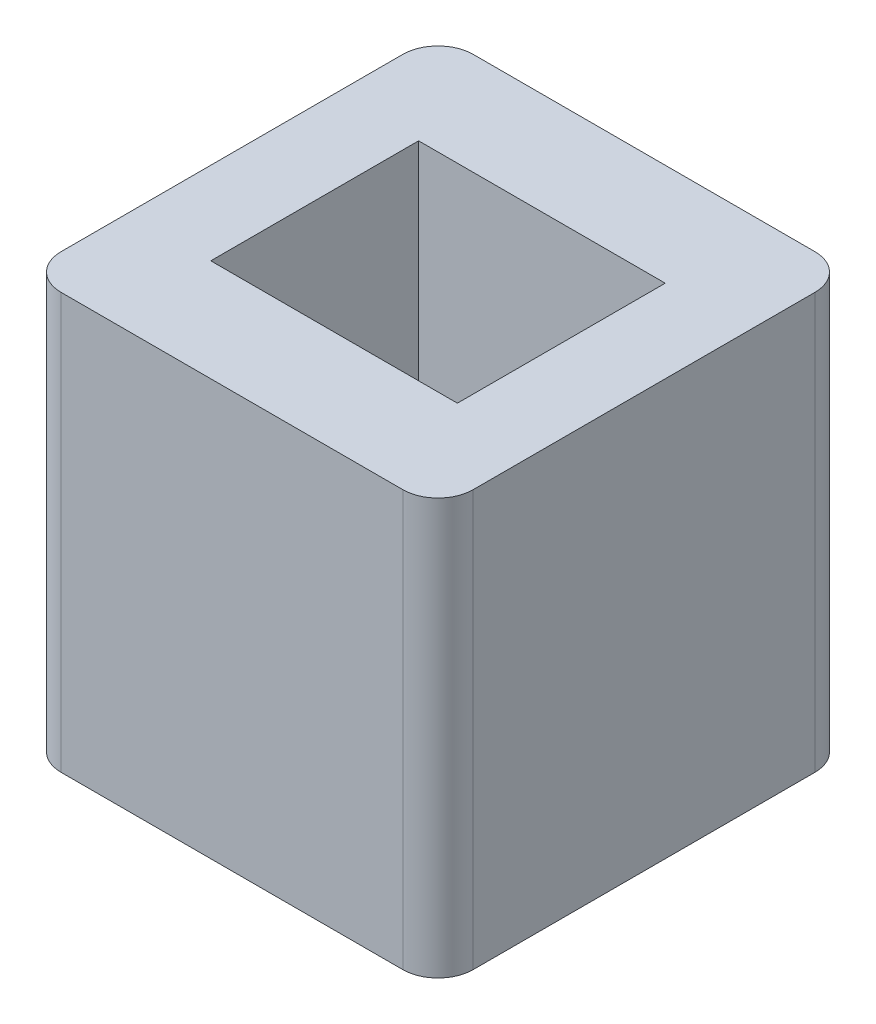
ISO-10303-21;
HEADER;
FILE_DESCRIPTION(('STEP AP214'),'2;1');
FILE_NAME('part.step','',(''),(''),'','','');
FILE_SCHEMA(('AUTOMOTIVE_DESIGN { 1 0 10303 214 1 1 1 1 }'));
ENDSEC;
DATA;
#1=APPLICATION_CONTEXT('core data for automotive mechanical design processes');
#2=APPLICATION_PROTOCOL_DEFINITION('international standard','automotive_design',2000,#1);
#3=PRODUCT_CONTEXT('',#1,'mechanical');
#4=PRODUCT('Part','Part','',(#3));
#5=PRODUCT_RELATED_PRODUCT_CATEGORY('part','',(#4));
#6=PRODUCT_DEFINITION_FORMATION('','',#4);
#7=PRODUCT_DEFINITION_CONTEXT('part definition',#1,'design');
#8=PRODUCT_DEFINITION('design','',#6,#7);
#9=PRODUCT_DEFINITION_SHAPE('','',#8);
#10=(LENGTH_UNIT() NAMED_UNIT(*) SI_UNIT(.MILLI.,.METRE.));
#11=(NAMED_UNIT(*) PLANE_ANGLE_UNIT() SI_UNIT($,.RADIAN.));
#12=(NAMED_UNIT(*) SI_UNIT($,.STERADIAN.) SOLID_ANGLE_UNIT());
#13=UNCERTAINTY_MEASURE_WITH_UNIT(LENGTH_MEASURE(1.E-05),#10,'distance_accuracy_value','');
#14=(GEOMETRIC_REPRESENTATION_CONTEXT(3) GLOBAL_UNCERTAINTY_ASSIGNED_CONTEXT((#13)) GLOBAL_UNIT_ASSIGNED_CONTEXT((#10,
#11,#12)) REPRESENTATION_CONTEXT('',''));
#15=CARTESIAN_POINT('',(0.,0.,0.));
#16=DIRECTION('',(0.,0.,1.));
#17=DIRECTION('',(1.,0.,0.));
#18=AXIS2_PLACEMENT_3D('',#15,#16,#17);
#19=CARTESIAN_POINT('',(-24.25,29.5,24.25));
#20=DIRECTION('',(0.,-1.,0.));
#21=DIRECTION('',(0.,0.,-1.));
#22=AXIS2_PLACEMENT_3D('',#19,#20,#21);
#23=PLANE('',#22);
#24=CARTESIAN_POINT('',(-24.25,29.5,24.25));
#25=DIRECTION('',(0.,1.,0.));
#26=DIRECTION('',(0.,0.,-1.));
#27=AXIS2_PLACEMENT_3D('',#24,#25,#26);
#28=CIRCLE('',#27,5.);
#29=CARTESIAN_POINT('',(-29.25,29.5,24.25));
#30=VERTEX_POINT('',#29);
#31=CARTESIAN_POINT('',(-24.25,29.5,29.25));
#32=VERTEX_POINT('',#31);
#33=EDGE_CURVE('E158',#30,#32,#28,.T.);
#34=ORIENTED_EDGE('',*,*,#33,.T.);
#35=DIRECTION('',(1.,0.,0.));
#36=VECTOR('',#35,1.);
#37=CARTESIAN_POINT('',(-24.25,29.5,29.25));
#38=LINE('',#37,#36);
#39=CARTESIAN_POINT('',(24.25,29.5,29.25));
#40=VERTEX_POINT('',#39);
#41=EDGE_CURVE('E161',#32,#40,#38,.T.);
#42=ORIENTED_EDGE('',*,*,#41,.T.);
#43=CARTESIAN_POINT('',(24.25,29.5,24.25));
#44=DIRECTION('',(0.,1.,0.));
#45=DIRECTION('',(0.,0.,-1.));
#46=AXIS2_PLACEMENT_3D('',#43,#44,#45);
#47=CIRCLE('',#46,5.);
#48=CARTESIAN_POINT('',(29.25,29.5,24.25));
#49=VERTEX_POINT('',#48);
#50=EDGE_CURVE('E164',#40,#49,#47,.T.);
#51=ORIENTED_EDGE('',*,*,#50,.T.);
#52=DIRECTION('',(0.,0.,-1.));
#53=VECTOR('',#52,1.);
#54=CARTESIAN_POINT('',(29.25,29.5,-24.25));
#55=LINE('',#54,#53);
#56=CARTESIAN_POINT('',(29.25,29.5,-24.25));
#57=VERTEX_POINT('',#56);
#58=EDGE_CURVE('E166',#49,#57,#55,.T.);
#59=ORIENTED_EDGE('',*,*,#58,.T.);
#60=CARTESIAN_POINT('',(24.25,29.5,-24.25));
#61=DIRECTION('',(0.,1.,0.));
#62=DIRECTION('',(0.,0.,1.));
#63=AXIS2_PLACEMENT_3D('',#60,#61,#62);
#64=CIRCLE('',#63,5.);
#65=CARTESIAN_POINT('',(24.25,29.5,-29.25));
#66=VERTEX_POINT('',#65);
#67=EDGE_CURVE('E168',#57,#66,#64,.T.);
#68=ORIENTED_EDGE('',*,*,#67,.T.);
#69=DIRECTION('',(-1.,0.,0.));
#70=VECTOR('',#69,1.);
#71=CARTESIAN_POINT('',(-24.25,29.5,-29.25));
#72=LINE('',#71,#70);
#73=CARTESIAN_POINT('',(-24.25,29.5,-29.25));
#74=VERTEX_POINT('',#73);
#75=EDGE_CURVE('E170',#66,#74,#72,.T.);
#76=ORIENTED_EDGE('',*,*,#75,.T.);
#77=CARTESIAN_POINT('',(-24.25,29.5,-24.25));
#78=DIRECTION('',(0.,1.,0.));
#79=DIRECTION('',(0.,0.,-1.));
#80=AXIS2_PLACEMENT_3D('',#77,#78,#79);
#81=CIRCLE('',#80,5.);
#82=CARTESIAN_POINT('',(-29.25,29.5,-24.25));
#83=VERTEX_POINT('',#82);
#84=EDGE_CURVE('E172',#74,#83,#81,.T.);
#85=ORIENTED_EDGE('',*,*,#84,.T.);
#86=DIRECTION('',(0.,0.,1.));
#87=VECTOR('',#86,1.);
#88=CARTESIAN_POINT('',(-29.25,29.5,-24.25));
#89=LINE('',#88,#87);
#90=EDGE_CURVE('E174',#83,#30,#89,.T.);
#91=ORIENTED_EDGE('',*,*,#90,.T.);
#92=EDGE_LOOP('',(#34,#42,#51,#59,#68,#76,#85,#91));
#93=FACE_BOUND('',#92,.T.);
#94=DIRECTION('',(0.,0.,-1.));
#95=VECTOR('',#94,1.);
#96=CARTESIAN_POINT('',(17.5,29.5,-14.75));
#97=LINE('',#96,#95);
#98=CARTESIAN_POINT('',(17.5,29.5,14.75));
#99=VERTEX_POINT('',#98);
#100=CARTESIAN_POINT('',(17.5,29.5,-14.75));
#101=VERTEX_POINT('',#100);
#102=EDGE_CURVE('E122',#99,#101,#97,.T.);
#103=ORIENTED_EDGE('',*,*,#102,.F.);
#104=DIRECTION('',(1.,0.,0.));
#105=VECTOR('',#104,1.);
#106=CARTESIAN_POINT('',(-17.5,29.5,14.75));
#107=LINE('',#106,#105);
#108=CARTESIAN_POINT('',(-17.5,29.5,14.75));
#109=VERTEX_POINT('',#108);
#110=EDGE_CURVE('E144',#109,#99,#107,.T.);
#111=ORIENTED_EDGE('',*,*,#110,.F.);
#112=DIRECTION('',(0.,0.,1.));
#113=VECTOR('',#112,1.);
#114=CARTESIAN_POINT('',(-17.5,29.5,-14.75));
#115=LINE('',#114,#113);
#116=CARTESIAN_POINT('',(-17.5,29.5,-14.75));
#117=VERTEX_POINT('',#116);
#118=EDGE_CURVE('E142',#117,#109,#115,.T.);
#119=ORIENTED_EDGE('',*,*,#118,.F.);
#120=DIRECTION('',(-1.,0.,0.));
#121=VECTOR('',#120,1.);
#122=CARTESIAN_POINT('',(-17.5,29.5,-14.75));
#123=LINE('',#122,#121);
#124=EDGE_CURVE('E130',#101,#117,#123,.T.);
#125=ORIENTED_EDGE('',*,*,#124,.F.);
#126=EDGE_LOOP('',(#103,#111,#119,#125));
#127=FACE_BOUND('',#126,.T.);
#128=ADVANCED_FACE('F33',(#93,#127),#23,.F.);
#129=CARTESIAN_POINT('',(-24.25,-29.5,24.25));
#130=DIRECTION('',(0.,-1.,0.));
#131=DIRECTION('',(0.,0.,-1.));
#132=AXIS2_PLACEMENT_3D('',#129,#130,#131);
#133=PLANE('',#132);
#134=CARTESIAN_POINT('',(-24.25,-29.5,24.25));
#135=DIRECTION('',(0.,1.,0.));
#136=DIRECTION('',(0.,0.,-1.));
#137=AXIS2_PLACEMENT_3D('',#134,#135,#136);
#138=CIRCLE('',#137,5.);
#139=CARTESIAN_POINT('',(-29.25,-29.5,24.25));
#140=VERTEX_POINT('',#139);
#141=CARTESIAN_POINT('',(-24.25,-29.5,29.25));
#142=VERTEX_POINT('',#141);
#143=EDGE_CURVE('E138',#140,#142,#138,.T.);
#144=ORIENTED_EDGE('',*,*,#143,.F.);
#145=DIRECTION('',(0.,0.,1.));
#146=VECTOR('',#145,1.);
#147=CARTESIAN_POINT('',(-29.25,-29.5,-24.25));
#148=LINE('',#147,#146);
#149=CARTESIAN_POINT('',(-29.25,-29.5,-24.25));
#150=VERTEX_POINT('',#149);
#151=EDGE_CURVE('E162',#150,#140,#148,.T.);
#152=ORIENTED_EDGE('',*,*,#151,.F.);
#153=CARTESIAN_POINT('',(-24.25,-29.5,-24.25));
#154=DIRECTION('',(0.,1.,0.));
#155=DIRECTION('',(0.,0.,-1.));
#156=AXIS2_PLACEMENT_3D('',#153,#154,#155);
#157=CIRCLE('',#156,5.);
#158=CARTESIAN_POINT('',(-24.25,-29.5,-29.25));
#159=VERTEX_POINT('',#158);
#160=EDGE_CURVE('E189',#159,#150,#157,.T.);
#161=ORIENTED_EDGE('',*,*,#160,.F.);
#162=DIRECTION('',(-1.,0.,0.));
#163=VECTOR('',#162,1.);
#164=CARTESIAN_POINT('',(-24.25,-29.5,-29.25));
#165=LINE('',#164,#163);
#166=CARTESIAN_POINT('',(24.25,-29.5,-29.25));
#167=VERTEX_POINT('',#166);
#168=EDGE_CURVE('E187',#167,#159,#165,.T.);
#169=ORIENTED_EDGE('',*,*,#168,.F.);
#170=CARTESIAN_POINT('',(24.25,-29.5,-24.25));
#171=DIRECTION('',(0.,1.,0.));
#172=DIRECTION('',(0.,0.,1.));
#173=AXIS2_PLACEMENT_3D('',#170,#171,#172);
#174=CIRCLE('',#173,5.);
#175=CARTESIAN_POINT('',(29.25,-29.5,-24.25));
#176=VERTEX_POINT('',#175);
#177=EDGE_CURVE('E185',#176,#167,#174,.T.);
#178=ORIENTED_EDGE('',*,*,#177,.F.);
#179=DIRECTION('',(0.,0.,-1.));
#180=VECTOR('',#179,1.);
#181=CARTESIAN_POINT('',(29.25,-29.5,-24.25));
#182=LINE('',#181,#180);
#183=CARTESIAN_POINT('',(29.25,-29.5,24.25));
#184=VERTEX_POINT('',#183);
#185=EDGE_CURVE('E183',#184,#176,#182,.T.);
#186=ORIENTED_EDGE('',*,*,#185,.F.);
#187=CARTESIAN_POINT('',(24.25,-29.5,24.25));
#188=DIRECTION('',(0.,1.,0.));
#189=DIRECTION('',(0.,0.,-1.));
#190=AXIS2_PLACEMENT_3D('',#187,#188,#189);
#191=CIRCLE('',#190,5.);
#192=CARTESIAN_POINT('',(24.25,-29.5,29.25));
#193=VERTEX_POINT('',#192);
#194=EDGE_CURVE('E181',#193,#184,#191,.T.);
#195=ORIENTED_EDGE('',*,*,#194,.F.);
#196=DIRECTION('',(1.,0.,0.));
#197=VECTOR('',#196,1.);
#198=CARTESIAN_POINT('',(-24.25,-29.5,29.25));
#199=LINE('',#198,#197);
#200=EDGE_CURVE('E179',#142,#193,#199,.T.);
#201=ORIENTED_EDGE('',*,*,#200,.F.);
#202=EDGE_LOOP('',(#144,#152,#161,#169,#178,#186,#195,#201));
#203=FACE_BOUND('',#202,.T.);
#204=DIRECTION('',(1.,0.,0.));
#205=VECTOR('',#204,1.);
#206=CARTESIAN_POINT('',(-17.5,-29.5,14.75));
#207=LINE('',#206,#205);
#208=CARTESIAN_POINT('',(-17.5,-29.5,14.75));
#209=VERTEX_POINT('',#208);
#210=CARTESIAN_POINT('',(17.5,-29.5,14.75));
#211=VERTEX_POINT('',#210);
#212=EDGE_CURVE('E131',#209,#211,#207,.T.);
#213=ORIENTED_EDGE('',*,*,#212,.T.);
#214=DIRECTION('',(0.,0.,-1.));
#215=VECTOR('',#214,1.);
#216=CARTESIAN_POINT('',(17.5,-29.5,-14.75));
#217=LINE('',#216,#215);
#218=CARTESIAN_POINT('',(17.5,-29.5,-14.75));
#219=VERTEX_POINT('',#218);
#220=EDGE_CURVE('E56',#211,#219,#217,.T.);
#221=ORIENTED_EDGE('',*,*,#220,.T.);
#222=DIRECTION('',(-1.,0.,0.));
#223=VECTOR('',#222,1.);
#224=CARTESIAN_POINT('',(-17.5,-29.5,-14.75));
#225=LINE('',#224,#223);
#226=CARTESIAN_POINT('',(-17.5,-29.5,-14.75));
#227=VERTEX_POINT('',#226);
#228=EDGE_CURVE('E137',#219,#227,#225,.T.);
#229=ORIENTED_EDGE('',*,*,#228,.T.);
#230=DIRECTION('',(0.,0.,1.));
#231=VECTOR('',#230,1.);
#232=CARTESIAN_POINT('',(-17.5,-29.5,-14.75));
#233=LINE('',#232,#231);
#234=EDGE_CURVE('E150',#227,#209,#233,.T.);
#235=ORIENTED_EDGE('',*,*,#234,.T.);
#236=EDGE_LOOP('',(#213,#221,#229,#235));
#237=FACE_BOUND('',#236,.T.);
#238=ADVANCED_FACE('F219',(#203,#237),#133,.T.);
#239=CARTESIAN_POINT('',(-24.25,29.5,24.25));
#240=DIRECTION('',(0.,-1.,0.));
#241=DIRECTION('',(0.,0.,-1.));
#242=AXIS2_PLACEMENT_3D('',#239,#240,#241);
#243=CYLINDRICAL_SURFACE('',#242,5.);
#244=ORIENTED_EDGE('',*,*,#143,.T.);
#245=DIRECTION('',(0.,-1.,0.));
#246=VECTOR('',#245,1.);
#247=CARTESIAN_POINT('',(-24.25,29.5,29.25));
#248=LINE('',#247,#246);
#249=EDGE_CURVE('E11',#32,#142,#248,.T.);
#250=ORIENTED_EDGE('',*,*,#249,.F.);
#251=ORIENTED_EDGE('',*,*,#33,.F.);
#252=DIRECTION('',(0.,-1.,0.));
#253=VECTOR('',#252,1.);
#254=CARTESIAN_POINT('',(-29.25,29.5,24.25));
#255=LINE('',#254,#253);
#256=EDGE_CURVE('E176',#30,#140,#255,.T.);
#257=ORIENTED_EDGE('',*,*,#256,.T.);
#258=EDGE_LOOP('',(#244,#250,#251,#257));
#259=FACE_BOUND('',#258,.T.);
#260=ADVANCED_FACE('F35',(#259),#243,.T.);
#261=CARTESIAN_POINT('',(-24.25,29.5,29.25));
#262=DIRECTION('',(0.,0.,-1.));
#263=DIRECTION('',(-1.,0.,0.));
#264=AXIS2_PLACEMENT_3D('',#261,#262,#263);
#265=PLANE('',#264);
#266=ORIENTED_EDGE('',*,*,#200,.T.);
#267=DIRECTION('',(0.,-1.,0.));
#268=VECTOR('',#267,1.);
#269=CARTESIAN_POINT('',(24.25,29.5,29.25));
#270=LINE('',#269,#268);
#271=EDGE_CURVE('E41',#40,#193,#270,.T.);
#272=ORIENTED_EDGE('',*,*,#271,.F.);
#273=ORIENTED_EDGE('',*,*,#41,.F.);
#274=ORIENTED_EDGE('',*,*,#249,.T.);
#275=EDGE_LOOP('',(#266,#272,#273,#274));
#276=FACE_BOUND('',#275,.T.);
#277=ADVANCED_FACE('F236',(#276),#265,.F.);
#278=CARTESIAN_POINT('',(24.25,29.5,24.25));
#279=DIRECTION('',(0.,-1.,0.));
#280=DIRECTION('',(0.,0.,-1.));
#281=AXIS2_PLACEMENT_3D('',#278,#279,#280);
#282=CYLINDRICAL_SURFACE('',#281,5.);
#283=ORIENTED_EDGE('',*,*,#194,.T.);
#284=DIRECTION('',(0.,-1.,0.));
#285=VECTOR('',#284,1.);
#286=CARTESIAN_POINT('',(29.25,29.5,24.25));
#287=LINE('',#286,#285);
#288=EDGE_CURVE('E206',#49,#184,#287,.T.);
#289=ORIENTED_EDGE('',*,*,#288,.F.);
#290=ORIENTED_EDGE('',*,*,#50,.F.);
#291=ORIENTED_EDGE('',*,*,#271,.T.);
#292=EDGE_LOOP('',(#283,#289,#290,#291));
#293=FACE_BOUND('',#292,.T.);
#294=ADVANCED_FACE('F213',(#293),#282,.T.);
#295=CARTESIAN_POINT('',(29.25,29.5,-24.25));
#296=DIRECTION('',(-1.,0.,0.));
#297=DIRECTION('',(0.,0.,1.));
#298=AXIS2_PLACEMENT_3D('',#295,#296,#297);
#299=PLANE('',#298);
#300=ORIENTED_EDGE('',*,*,#185,.T.);
#301=DIRECTION('',(0.,-1.,0.));
#302=VECTOR('',#301,1.);
#303=CARTESIAN_POINT('',(29.25,29.5,-24.25));
#304=LINE('',#303,#302);
#305=EDGE_CURVE('E203',#57,#176,#304,.T.);
#306=ORIENTED_EDGE('',*,*,#305,.F.);
#307=ORIENTED_EDGE('',*,*,#58,.F.);
#308=ORIENTED_EDGE('',*,*,#288,.T.);
#309=EDGE_LOOP('',(#300,#306,#307,#308));
#310=FACE_BOUND('',#309,.T.);
#311=ADVANCED_FACE('F225',(#310),#299,.F.);
#312=CARTESIAN_POINT('',(24.25,29.5,-24.25));
#313=DIRECTION('',(0.,-1.,0.));
#314=DIRECTION('',(0.,0.,-1.));
#315=AXIS2_PLACEMENT_3D('',#312,#313,#314);
#316=CYLINDRICAL_SURFACE('',#315,5.);
#317=ORIENTED_EDGE('',*,*,#177,.T.);
#318=DIRECTION('',(0.,-1.,0.));
#319=VECTOR('',#318,1.);
#320=CARTESIAN_POINT('',(24.25,29.5,-29.25));
#321=LINE('',#320,#319);
#322=EDGE_CURVE('E200',#66,#167,#321,.T.);
#323=ORIENTED_EDGE('',*,*,#322,.F.);
#324=ORIENTED_EDGE('',*,*,#67,.F.);
#325=ORIENTED_EDGE('',*,*,#305,.T.);
#326=EDGE_LOOP('',(#317,#323,#324,#325));
#327=FACE_BOUND('',#326,.T.);
#328=ADVANCED_FACE('F229',(#327),#316,.T.);
#329=CARTESIAN_POINT('',(-24.25,29.5,-29.25));
#330=DIRECTION('',(0.,0.,1.));
#331=DIRECTION('',(1.,0.,0.));
#332=AXIS2_PLACEMENT_3D('',#329,#330,#331);
#333=PLANE('',#332);
#334=ORIENTED_EDGE('',*,*,#168,.T.);
#335=DIRECTION('',(0.,-1.,0.));
#336=VECTOR('',#335,1.);
#337=CARTESIAN_POINT('',(-24.25,29.5,-29.25));
#338=LINE('',#337,#336);
#339=EDGE_CURVE('E197',#74,#159,#338,.T.);
#340=ORIENTED_EDGE('',*,*,#339,.F.);
#341=ORIENTED_EDGE('',*,*,#75,.F.);
#342=ORIENTED_EDGE('',*,*,#322,.T.);
#343=EDGE_LOOP('',(#334,#340,#341,#342));
#344=FACE_BOUND('',#343,.T.);
#345=ADVANCED_FACE('F249',(#344),#333,.F.);
#346=CARTESIAN_POINT('',(-24.25,29.5,-24.25));
#347=DIRECTION('',(0.,-1.,0.));
#348=DIRECTION('',(0.,0.,-1.));
#349=AXIS2_PLACEMENT_3D('',#346,#347,#348);
#350=CYLINDRICAL_SURFACE('',#349,5.);
#351=ORIENTED_EDGE('',*,*,#160,.T.);
#352=DIRECTION('',(0.,-1.,0.));
#353=VECTOR('',#352,1.);
#354=CARTESIAN_POINT('',(-29.25,29.5,-24.25));
#355=LINE('',#354,#353);
#356=EDGE_CURVE('E194',#83,#150,#355,.T.);
#357=ORIENTED_EDGE('',*,*,#356,.F.);
#358=ORIENTED_EDGE('',*,*,#84,.F.);
#359=ORIENTED_EDGE('',*,*,#339,.T.);
#360=EDGE_LOOP('',(#351,#357,#358,#359));
#361=FACE_BOUND('',#360,.T.);
#362=ADVANCED_FACE('F247',(#361),#350,.T.);
#363=CARTESIAN_POINT('',(-29.25,29.5,-24.25));
#364=DIRECTION('',(1.,0.,0.));
#365=DIRECTION('',(0.,0.,-1.));
#366=AXIS2_PLACEMENT_3D('',#363,#364,#365);
#367=PLANE('',#366);
#368=ORIENTED_EDGE('',*,*,#151,.T.);
#369=ORIENTED_EDGE('',*,*,#256,.F.);
#370=ORIENTED_EDGE('',*,*,#90,.F.);
#371=ORIENTED_EDGE('',*,*,#356,.T.);
#372=EDGE_LOOP('',(#368,#369,#370,#371));
#373=FACE_BOUND('',#372,.T.);
#374=ADVANCED_FACE('F242',(#373),#367,.F.);
#375=CARTESIAN_POINT('',(17.5,29.5,-14.75));
#376=DIRECTION('',(-1.,0.,0.));
#377=DIRECTION('',(0.,0.,1.));
#378=AXIS2_PLACEMENT_3D('',#375,#376,#377);
#379=PLANE('',#378);
#380=ORIENTED_EDGE('',*,*,#220,.F.);
#381=DIRECTION('',(0.,-1.,0.));
#382=VECTOR('',#381,1.);
#383=CARTESIAN_POINT('',(17.5,29.5,14.75));
#384=LINE('',#383,#382);
#385=EDGE_CURVE('E126',#99,#211,#384,.T.);
#386=ORIENTED_EDGE('',*,*,#385,.F.);
#387=ORIENTED_EDGE('',*,*,#102,.T.);
#388=DIRECTION('',(0.,-1.,0.));
#389=VECTOR('',#388,1.);
#390=CARTESIAN_POINT('',(17.5,29.5,-14.75));
#391=LINE('',#390,#389);
#392=EDGE_CURVE('E125',#101,#219,#391,.T.);
#393=ORIENTED_EDGE('',*,*,#392,.T.);
#394=EDGE_LOOP('',(#380,#386,#387,#393));
#395=FACE_BOUND('',#394,.T.);
#396=ADVANCED_FACE('F124',(#395),#379,.T.);
#397=CARTESIAN_POINT('',(-17.5,29.5,-14.75));
#398=DIRECTION('',(0.,0.,1.));
#399=DIRECTION('',(1.,0.,0.));
#400=AXIS2_PLACEMENT_3D('',#397,#398,#399);
#401=PLANE('',#400);
#402=ORIENTED_EDGE('',*,*,#228,.F.);
#403=ORIENTED_EDGE('',*,*,#392,.F.);
#404=ORIENTED_EDGE('',*,*,#124,.T.);
#405=DIRECTION('',(0.,-1.,0.));
#406=VECTOR('',#405,1.);
#407=CARTESIAN_POINT('',(-17.5,29.5,-14.75));
#408=LINE('',#407,#406);
#409=EDGE_CURVE('E139',#117,#227,#408,.T.);
#410=ORIENTED_EDGE('',*,*,#409,.T.);
#411=EDGE_LOOP('',(#402,#403,#404,#410));
#412=FACE_BOUND('',#411,.T.);
#413=ADVANCED_FACE('F134',(#412),#401,.T.);
#414=CARTESIAN_POINT('',(-17.5,29.5,-14.75));
#415=DIRECTION('',(1.,0.,0.));
#416=DIRECTION('',(0.,0.,-1.));
#417=AXIS2_PLACEMENT_3D('',#414,#415,#416);
#418=PLANE('',#417);
#419=ORIENTED_EDGE('',*,*,#234,.F.);
#420=ORIENTED_EDGE('',*,*,#409,.F.);
#421=ORIENTED_EDGE('',*,*,#118,.T.);
#422=DIRECTION('',(0.,-1.,0.));
#423=VECTOR('',#422,1.);
#424=CARTESIAN_POINT('',(-17.5,29.5,14.75));
#425=LINE('',#424,#423);
#426=EDGE_CURVE('E48',#109,#209,#425,.T.);
#427=ORIENTED_EDGE('',*,*,#426,.T.);
#428=EDGE_LOOP('',(#419,#420,#421,#427));
#429=FACE_BOUND('',#428,.T.);
#430=ADVANCED_FACE('F274',(#429),#418,.T.);
#431=CARTESIAN_POINT('',(-17.5,29.5,14.75));
#432=DIRECTION('',(0.,0.,-1.));
#433=DIRECTION('',(-1.,0.,0.));
#434=AXIS2_PLACEMENT_3D('',#431,#432,#433);
#435=PLANE('',#434);
#436=ORIENTED_EDGE('',*,*,#212,.F.);
#437=ORIENTED_EDGE('',*,*,#426,.F.);
#438=ORIENTED_EDGE('',*,*,#110,.T.);
#439=ORIENTED_EDGE('',*,*,#385,.T.);
#440=EDGE_LOOP('',(#436,#437,#438,#439));
#441=FACE_BOUND('',#440,.T.);
#442=ADVANCED_FACE('F278',(#441),#435,.T.);
#443=CLOSED_SHELL('',(#128,#238,#260,#277,#294,#311,#328,#345,#362,#374,#396,#413,#430,#442));
#444=MANIFOLD_SOLID_BREP('B2',#443);
#445=ADVANCED_BREP_SHAPE_REPRESENTATION('',(#18,#444),#14);
#446=SHAPE_DEFINITION_REPRESENTATION(#9,#445);
ENDSEC;
END-ISO-10303-21;
